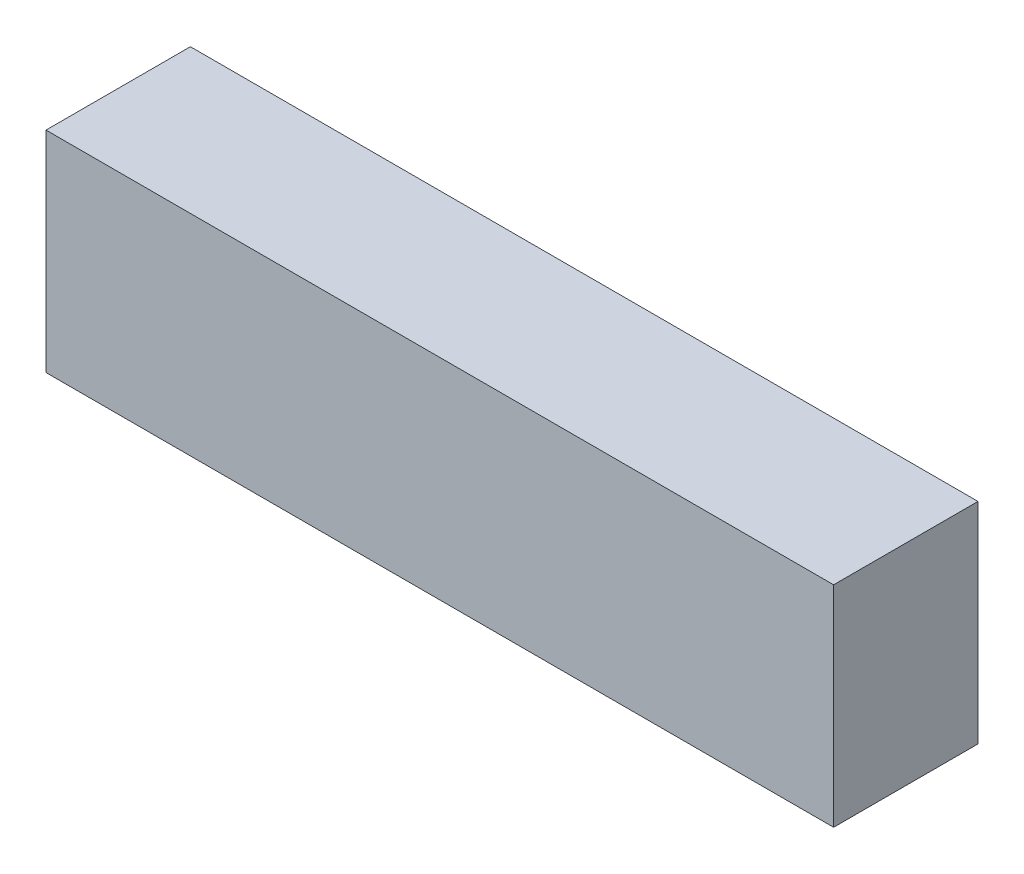
ISO-10303-21;
HEADER;
FILE_DESCRIPTION(('STEP AP214'),'2;1');
FILE_NAME('part.step','',(''),(''),'','','');
FILE_SCHEMA(('AUTOMOTIVE_DESIGN { 1 0 10303 214 1 1 1 1 }'));
ENDSEC;
DATA;
#1=APPLICATION_CONTEXT('core data for automotive mechanical design processes');
#2=APPLICATION_PROTOCOL_DEFINITION('international standard','automotive_design',2000,#1);
#3=PRODUCT_CONTEXT('',#1,'mechanical');
#4=PRODUCT('Part','Part','',(#3));
#5=PRODUCT_RELATED_PRODUCT_CATEGORY('part','',(#4));
#6=PRODUCT_DEFINITION_FORMATION('','',#4);
#7=PRODUCT_DEFINITION_CONTEXT('part definition',#1,'design');
#8=PRODUCT_DEFINITION('design','',#6,#7);
#9=PRODUCT_DEFINITION_SHAPE('','',#8);
#10=(LENGTH_UNIT() NAMED_UNIT(*) SI_UNIT(.MILLI.,.METRE.));
#11=(NAMED_UNIT(*) PLANE_ANGLE_UNIT() SI_UNIT($,.RADIAN.));
#12=(NAMED_UNIT(*) SI_UNIT($,.STERADIAN.) SOLID_ANGLE_UNIT());
#13=UNCERTAINTY_MEASURE_WITH_UNIT(LENGTH_MEASURE(1.E-05),#10,'distance_accuracy_value','');
#14=(GEOMETRIC_REPRESENTATION_CONTEXT(3) GLOBAL_UNCERTAINTY_ASSIGNED_CONTEXT((#13)) GLOBAL_UNIT_ASSIGNED_CONTEXT((#10,
#11,#12)) REPRESENTATION_CONTEXT('',''));
#15=CARTESIAN_POINT('',(0.,0.,0.));
#16=DIRECTION('',(0.,0.,1.));
#17=DIRECTION('',(1.,0.,0.));
#18=AXIS2_PLACEMENT_3D('',#15,#16,#17);
#19=CARTESIAN_POINT('',(-15.,8.,2.75));
#20=DIRECTION('',(1.,0.,0.));
#21=DIRECTION('',(0.,0.,-1.));
#22=AXIS2_PLACEMENT_3D('',#19,#20,#21);
#23=PLANE('',#22);
#24=DIRECTION('',(0.,0.,1.));
#25=VECTOR('',#24,1.);
#26=CARTESIAN_POINT('',(-15.,0.,2.75));
#27=LINE('',#26,#25);
#28=CARTESIAN_POINT('',(-15.,0.,-2.75));
#29=VERTEX_POINT('',#28);
#30=CARTESIAN_POINT('',(-15.,0.,2.75));
#31=VERTEX_POINT('',#30);
#32=EDGE_CURVE('E104',#29,#31,#27,.T.);
#33=ORIENTED_EDGE('',*,*,#32,.T.);
#34=DIRECTION('',(0.,-1.,0.));
#35=VECTOR('',#34,1.);
#36=CARTESIAN_POINT('',(-15.,8.,2.75));
#37=LINE('',#36,#35);
#38=CARTESIAN_POINT('',(-15.,8.,2.75));
#39=VERTEX_POINT('',#38);
#40=EDGE_CURVE('E11',#39,#31,#37,.T.);
#41=ORIENTED_EDGE('',*,*,#40,.F.);
#42=DIRECTION('',(0.,0.,1.));
#43=VECTOR('',#42,1.);
#44=CARTESIAN_POINT('',(-15.,8.,2.75));
#45=LINE('',#44,#43);
#46=CARTESIAN_POINT('',(-15.,8.,-2.75));
#47=VERTEX_POINT('',#46);
#48=EDGE_CURVE('E92',#47,#39,#45,.T.);
#49=ORIENTED_EDGE('',*,*,#48,.F.);
#50=DIRECTION('',(0.,-1.,0.));
#51=VECTOR('',#50,1.);
#52=CARTESIAN_POINT('',(-15.,8.,-2.75));
#53=LINE('',#52,#51);
#54=EDGE_CURVE('E100',#47,#29,#53,.T.);
#55=ORIENTED_EDGE('',*,*,#54,.T.);
#56=EDGE_LOOP('',(#33,#41,#49,#55));
#57=FACE_BOUND('',#56,.T.);
#58=ADVANCED_FACE('F41',(#57),#23,.F.);
#59=CARTESIAN_POINT('',(15.,8.,2.75));
#60=DIRECTION('',(0.,0.,-1.));
#61=DIRECTION('',(-1.,0.,0.));
#62=AXIS2_PLACEMENT_3D('',#59,#60,#61);
#63=PLANE('',#62);
#64=DIRECTION('',(1.,0.,0.));
#65=VECTOR('',#64,1.);
#66=CARTESIAN_POINT('',(15.,0.,2.75));
#67=LINE('',#66,#65);
#68=CARTESIAN_POINT('',(15.,0.,2.75));
#69=VERTEX_POINT('',#68);
#70=EDGE_CURVE('E96',#31,#69,#67,.T.);
#71=ORIENTED_EDGE('',*,*,#70,.T.);
#72=DIRECTION('',(0.,-1.,0.));
#73=VECTOR('',#72,1.);
#74=CARTESIAN_POINT('',(15.,8.,2.75));
#75=LINE('',#74,#73);
#76=CARTESIAN_POINT('',(15.,8.,2.75));
#77=VERTEX_POINT('',#76);
#78=EDGE_CURVE('E49',#77,#69,#75,.T.);
#79=ORIENTED_EDGE('',*,*,#78,.F.);
#80=DIRECTION('',(1.,0.,0.));
#81=VECTOR('',#80,1.);
#82=CARTESIAN_POINT('',(15.,8.,2.75));
#83=LINE('',#82,#81);
#84=EDGE_CURVE('E87',#39,#77,#83,.T.);
#85=ORIENTED_EDGE('',*,*,#84,.F.);
#86=ORIENTED_EDGE('',*,*,#40,.T.);
#87=EDGE_LOOP('',(#71,#79,#85,#86));
#88=FACE_BOUND('',#87,.T.);
#89=ADVANCED_FACE('F95',(#88),#63,.F.);
#90=CARTESIAN_POINT('',(15.,8.,2.75));
#91=DIRECTION('',(-1.,0.,0.));
#92=DIRECTION('',(0.,0.,1.));
#93=AXIS2_PLACEMENT_3D('',#90,#91,#92);
#94=PLANE('',#93);
#95=DIRECTION('',(0.,0.,-1.));
#96=VECTOR('',#95,1.);
#97=CARTESIAN_POINT('',(15.,0.,2.75));
#98=LINE('',#97,#96);
#99=CARTESIAN_POINT('',(15.,0.,-2.75));
#100=VERTEX_POINT('',#99);
#101=EDGE_CURVE('E74',#69,#100,#98,.T.);
#102=ORIENTED_EDGE('',*,*,#101,.T.);
#103=DIRECTION('',(0.,-1.,0.));
#104=VECTOR('',#103,1.);
#105=CARTESIAN_POINT('',(15.,8.,-2.75));
#106=LINE('',#105,#104);
#107=CARTESIAN_POINT('',(15.,8.,-2.75));
#108=VERTEX_POINT('',#107);
#109=EDGE_CURVE('E97',#108,#100,#106,.T.);
#110=ORIENTED_EDGE('',*,*,#109,.F.);
#111=DIRECTION('',(0.,0.,-1.));
#112=VECTOR('',#111,1.);
#113=CARTESIAN_POINT('',(15.,8.,2.75));
#114=LINE('',#113,#112);
#115=EDGE_CURVE('E90',#77,#108,#114,.T.);
#116=ORIENTED_EDGE('',*,*,#115,.F.);
#117=ORIENTED_EDGE('',*,*,#78,.T.);
#118=EDGE_LOOP('',(#102,#110,#116,#117));
#119=FACE_BOUND('',#118,.T.);
#120=ADVANCED_FACE('F98',(#119),#94,.F.);
#121=CARTESIAN_POINT('',(15.,8.,-2.75));
#122=DIRECTION('',(0.,0.,1.));
#123=DIRECTION('',(1.,0.,0.));
#124=AXIS2_PLACEMENT_3D('',#121,#122,#123);
#125=PLANE('',#124);
#126=DIRECTION('',(-1.,0.,0.));
#127=VECTOR('',#126,1.);
#128=CARTESIAN_POINT('',(15.,0.,-2.75));
#129=LINE('',#128,#127);
#130=EDGE_CURVE('E80',#100,#29,#129,.T.);
#131=ORIENTED_EDGE('',*,*,#130,.T.);
#132=ORIENTED_EDGE('',*,*,#54,.F.);
#133=DIRECTION('',(-1.,0.,0.));
#134=VECTOR('',#133,1.);
#135=CARTESIAN_POINT('',(15.,8.,-2.75));
#136=LINE('',#135,#134);
#137=EDGE_CURVE('E57',#108,#47,#136,.T.);
#138=ORIENTED_EDGE('',*,*,#137,.F.);
#139=ORIENTED_EDGE('',*,*,#109,.T.);
#140=EDGE_LOOP('',(#131,#132,#138,#139));
#141=FACE_BOUND('',#140,.T.);
#142=ADVANCED_FACE('F111',(#141),#125,.F.);
#143=CARTESIAN_POINT('',(0.,8.,0.));
#144=DIRECTION('',(0.,1.,0.));
#145=DIRECTION('',(0.,0.,1.));
#146=AXIS2_PLACEMENT_3D('',#143,#144,#145);
#147=PLANE('',#146);
#148=ORIENTED_EDGE('',*,*,#48,.T.);
#149=ORIENTED_EDGE('',*,*,#84,.T.);
#150=ORIENTED_EDGE('',*,*,#115,.T.);
#151=ORIENTED_EDGE('',*,*,#137,.T.);
#152=EDGE_LOOP('',(#148,#149,#150,#151));
#153=FACE_BOUND('',#152,.T.);
#154=ADVANCED_FACE('F88',(#153),#147,.T.);
#155=CARTESIAN_POINT('',(0.,0.,0.));
#156=DIRECTION('',(0.,1.,0.));
#157=DIRECTION('',(0.,0.,1.));
#158=AXIS2_PLACEMENT_3D('',#155,#156,#157);
#159=PLANE('',#158);
#160=ORIENTED_EDGE('',*,*,#32,.F.);
#161=ORIENTED_EDGE('',*,*,#130,.F.);
#162=ORIENTED_EDGE('',*,*,#101,.F.);
#163=ORIENTED_EDGE('',*,*,#70,.F.);
#164=EDGE_LOOP('',(#160,#161,#162,#163));
#165=FACE_BOUND('',#164,.T.);
#166=ADVANCED_FACE('F114',(#165),#159,.F.);
#167=CLOSED_SHELL('',(#58,#89,#120,#142,#154,#166));
#168=MANIFOLD_SOLID_BREP('B2',#167);
#169=ADVANCED_BREP_SHAPE_REPRESENTATION('',(#18,#168),#14);
#170=SHAPE_DEFINITION_REPRESENTATION(#9,#169);
ENDSEC;
END-ISO-10303-21;
